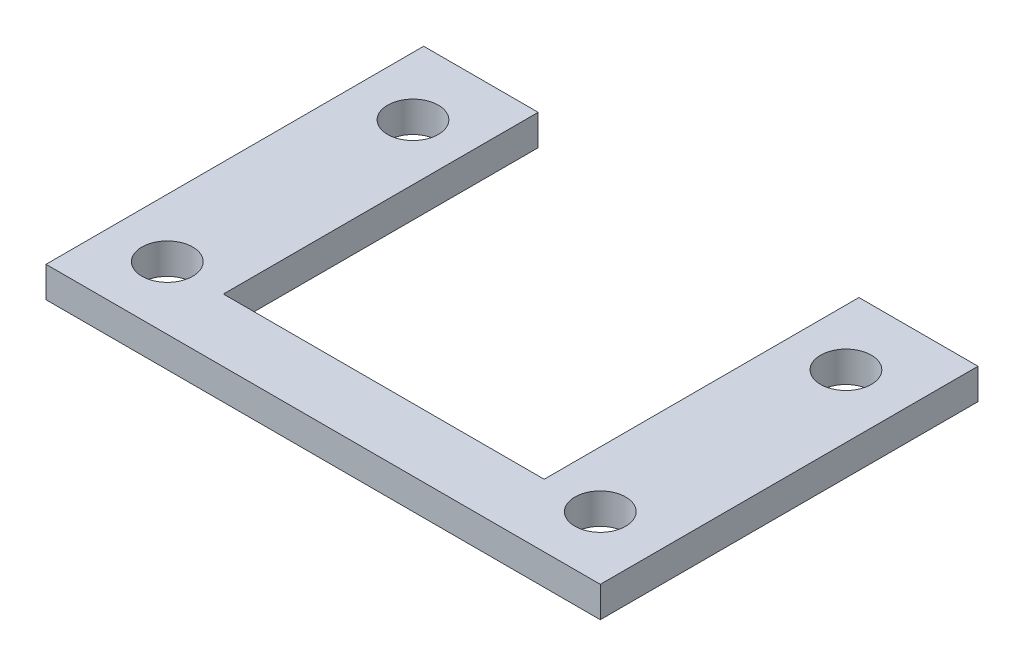
ISO-10303-21;
HEADER;
FILE_DESCRIPTION(('STEP AP214'),'2;1');
FILE_NAME('part.step','',(''),(''),'','','');
FILE_SCHEMA(('AUTOMOTIVE_DESIGN { 1 0 10303 214 1 1 1 1 }'));
ENDSEC;
DATA;
#1=APPLICATION_CONTEXT('core data for automotive mechanical design processes');
#2=APPLICATION_PROTOCOL_DEFINITION('international standard','automotive_design',2000,#1);
#3=PRODUCT_CONTEXT('',#1,'mechanical');
#4=PRODUCT('Part','Part','',(#3));
#5=PRODUCT_RELATED_PRODUCT_CATEGORY('part','',(#4));
#6=PRODUCT_DEFINITION_FORMATION('','',#4);
#7=PRODUCT_DEFINITION_CONTEXT('part definition',#1,'design');
#8=PRODUCT_DEFINITION('design','',#6,#7);
#9=PRODUCT_DEFINITION_SHAPE('','',#8);
#10=(LENGTH_UNIT() NAMED_UNIT(*) SI_UNIT(.MILLI.,.METRE.));
#11=(NAMED_UNIT(*) PLANE_ANGLE_UNIT() SI_UNIT($,.RADIAN.));
#12=(NAMED_UNIT(*) SI_UNIT($,.STERADIAN.) SOLID_ANGLE_UNIT());
#13=UNCERTAINTY_MEASURE_WITH_UNIT(LENGTH_MEASURE(1.E-05),#10,'distance_accuracy_value','');
#14=(GEOMETRIC_REPRESENTATION_CONTEXT(3) GLOBAL_UNCERTAINTY_ASSIGNED_CONTEXT((#13)) GLOBAL_UNIT_ASSIGNED_CONTEXT((#10,
#11,#12)) REPRESENTATION_CONTEXT('',''));
#15=CARTESIAN_POINT('',(0.,0.,0.));
#16=DIRECTION('',(0.,0.,1.));
#17=DIRECTION('',(1.,0.,0.));
#18=AXIS2_PLACEMENT_3D('',#15,#16,#17);
#19=CARTESIAN_POINT('',(0.,2.54,0.));
#20=DIRECTION('',(0.,1.,0.));
#21=DIRECTION('',(0.,0.,1.));
#22=AXIS2_PLACEMENT_3D('',#19,#20,#21);
#23=PLANE('',#22);
#24=CARTESIAN_POINT('',(56.209107250434,2.54,-23.3955963790764));
#25=DIRECTION('',(0.,1.,0.));
#26=DIRECTION('',(0.,0.,1.));
#27=AXIS2_PLACEMENT_3D('',#24,#25,#26);
#28=CIRCLE('',#27,2.09999999999999);
#29=CARTESIAN_POINT('',(56.209107250434,2.54,-21.2955963790764));
#30=VERTEX_POINT('',#29);
#31=EDGE_CURVE('E221',#30,#30,#28,.T.);
#32=ORIENTED_EDGE('',*,*,#31,.F.);
#33=EDGE_LOOP('',(#32));
#34=FACE_BOUND('',#33,.T.);
#35=CARTESIAN_POINT('',(20.395107250434,2.54,-23.3955963790764));
#36=DIRECTION('',(0.,1.,0.));
#37=DIRECTION('',(0.,0.,1.));
#38=AXIS2_PLACEMENT_3D('',#35,#36,#37);
#39=CIRCLE('',#38,2.1);
#40=CARTESIAN_POINT('',(20.395107250434,2.54,-21.2955963790764));
#41=VERTEX_POINT('',#40);
#42=EDGE_CURVE('E146',#41,#41,#39,.T.);
#43=ORIENTED_EDGE('',*,*,#42,.F.);
#44=EDGE_LOOP('',(#43));
#45=FACE_BOUND('',#44,.T.);
#46=DIRECTION('',(0.,0.,1.));
#47=VECTOR('',#46,1.);
#48=CARTESIAN_POINT('',(15.5691041376411,2.54,-29.1105972946034));
#49=LINE('',#48,#47);
#50=CARTESIAN_POINT('',(15.5691041376411,2.54,-29.1105972946034));
#51=VERTEX_POINT('',#50);
#52=CARTESIAN_POINT('',(15.5691041376411,2.54,2.13140328523063));
#53=VERTEX_POINT('',#52);
#54=EDGE_CURVE('E164',#51,#53,#49,.T.);
#55=ORIENTED_EDGE('',*,*,#54,.T.);
#56=DIRECTION('',(1.,0.,0.));
#57=VECTOR('',#56,1.);
#58=CARTESIAN_POINT('',(15.5691041376411,2.54,2.13140328523063));
#59=LINE('',#58,#57);
#60=CARTESIAN_POINT('',(61.4161118891041,2.54,2.13140328523063));
#61=VERTEX_POINT('',#60);
#62=EDGE_CURVE('E100',#53,#61,#59,.T.);
#63=ORIENTED_EDGE('',*,*,#62,.T.);
#64=DIRECTION('',(0.,0.,-1.));
#65=VECTOR('',#64,1.);
#66=CARTESIAN_POINT('',(61.4161118891041,2.54,-29.1105972946034));
#67=LINE('',#66,#65);
#68=CARTESIAN_POINT('',(61.4161118891041,2.54,-29.1105972946034));
#69=VERTEX_POINT('',#68);
#70=EDGE_CURVE('E185',#61,#69,#67,.T.);
#71=ORIENTED_EDGE('',*,*,#70,.T.);
#72=DIRECTION('',(-1.,0.,0.));
#73=VECTOR('',#72,1.);
#74=CARTESIAN_POINT('',(51.5691072504341,2.54,-29.1105972946034));
#75=LINE('',#74,#73);
#76=CARTESIAN_POINT('',(51.5691072504341,2.54,-29.1105972946034));
#77=VERTEX_POINT('',#76);
#78=EDGE_CURVE('E199',#69,#77,#75,.T.);
#79=ORIENTED_EDGE('',*,*,#78,.T.);
#80=DIRECTION('',(0.,0.,1.));
#81=VECTOR('',#80,1.);
#82=CARTESIAN_POINT('',(51.5691072504341,2.54,-29.1105972946034));
#83=LINE('',#82,#81);
#84=CARTESIAN_POINT('',(51.5691072504341,2.54,-3.07559637907637));
#85=VERTEX_POINT('',#84);
#86=EDGE_CURVE('E119',#77,#85,#83,.T.);
#87=ORIENTED_EDGE('',*,*,#86,.T.);
#88=DIRECTION('',(-1.,0.,0.));
#89=VECTOR('',#88,1.);
#90=CARTESIAN_POINT('',(25.035107250434,2.54,-3.07559637907637));
#91=LINE('',#90,#89);
#92=CARTESIAN_POINT('',(25.035107250434,2.54,-3.07559637907637));
#93=VERTEX_POINT('',#92);
#94=EDGE_CURVE('E113',#85,#93,#91,.T.);
#95=ORIENTED_EDGE('',*,*,#94,.T.);
#96=DIRECTION('',(0.,0.,-1.));
#97=VECTOR('',#96,1.);
#98=CARTESIAN_POINT('',(25.035107250434,2.54,-29.1105972946034));
#99=LINE('',#98,#97);
#100=CARTESIAN_POINT('',(25.035107250434,2.54,-29.1105972946034));
#101=VERTEX_POINT('',#100);
#102=EDGE_CURVE('E117',#93,#101,#99,.T.);
#103=ORIENTED_EDGE('',*,*,#102,.T.);
#104=DIRECTION('',(-1.,0.,0.));
#105=VECTOR('',#104,1.);
#106=CARTESIAN_POINT('',(15.5691041376411,2.54,-29.1105972946034));
#107=LINE('',#106,#105);
#108=EDGE_CURVE('E57',#101,#51,#107,.T.);
#109=ORIENTED_EDGE('',*,*,#108,.T.);
#110=EDGE_LOOP('',(#55,#63,#71,#79,#87,#95,#103,#109));
#111=FACE_BOUND('',#110,.T.);
#112=CARTESIAN_POINT('',(20.395107250434,2.54,-3.07559637907637));
#113=DIRECTION('',(0.,1.,0.));
#114=DIRECTION('',(0.,0.,1.));
#115=AXIS2_PLACEMENT_3D('',#112,#113,#114);
#116=CIRCLE('',#115,2.1);
#117=CARTESIAN_POINT('',(20.395107250434,2.54,-0.975596379076362));
#118=VERTEX_POINT('',#117);
#119=EDGE_CURVE('E213',#118,#118,#116,.T.);
#120=ORIENTED_EDGE('',*,*,#119,.F.);
#121=EDGE_LOOP('',(#120));
#122=FACE_BOUND('',#121,.T.);
#123=CARTESIAN_POINT('',(56.209107250434,2.54,-3.07559637907637));
#124=DIRECTION('',(0.,1.,0.));
#125=DIRECTION('',(0.,0.,1.));
#126=AXIS2_PLACEMENT_3D('',#123,#124,#125);
#127=CIRCLE('',#126,2.09999999999999);
#128=CARTESIAN_POINT('',(56.209107250434,2.54,-0.975596379076378));
#129=VERTEX_POINT('',#128);
#130=EDGE_CURVE('E229',#129,#129,#127,.T.);
#131=ORIENTED_EDGE('',*,*,#130,.F.);
#132=EDGE_LOOP('',(#131));
#133=FACE_BOUND('',#132,.T.);
#134=ADVANCED_FACE('F39',(#34,#45,#111,#122,#133),#23,.T.);
#135=CARTESIAN_POINT('',(0.,0.,0.));
#136=DIRECTION('',(0.,1.,0.));
#137=DIRECTION('',(0.,0.,1.));
#138=AXIS2_PLACEMENT_3D('',#135,#136,#137);
#139=PLANE('',#138);
#140=DIRECTION('',(0.,0.,1.));
#141=VECTOR('',#140,1.);
#142=CARTESIAN_POINT('',(15.5691041376411,0.,-29.1105972946034));
#143=LINE('',#142,#141);
#144=CARTESIAN_POINT('',(15.5691041376411,0.,-29.1105972946034));
#145=VERTEX_POINT('',#144);
#146=CARTESIAN_POINT('',(15.5691041376411,0.,2.13140328523063));
#147=VERTEX_POINT('',#146);
#148=EDGE_CURVE('E141',#145,#147,#143,.T.);
#149=ORIENTED_EDGE('',*,*,#148,.F.);
#150=DIRECTION('',(-1.,0.,0.));
#151=VECTOR('',#150,1.);
#152=CARTESIAN_POINT('',(15.5691041376411,0.,-29.1105972946034));
#153=LINE('',#152,#151);
#154=CARTESIAN_POINT('',(25.035107250434,0.,-29.1105972946034));
#155=VERTEX_POINT('',#154);
#156=EDGE_CURVE('E92',#155,#145,#153,.T.);
#157=ORIENTED_EDGE('',*,*,#156,.F.);
#158=DIRECTION('',(0.,0.,-1.));
#159=VECTOR('',#158,1.);
#160=CARTESIAN_POINT('',(25.035107250434,0.,-29.1105972946034));
#161=LINE('',#160,#159);
#162=CARTESIAN_POINT('',(25.035107250434,0.,-3.07559637907637));
#163=VERTEX_POINT('',#162);
#164=EDGE_CURVE('E86',#163,#155,#161,.T.);
#165=ORIENTED_EDGE('',*,*,#164,.F.);
#166=DIRECTION('',(-1.,0.,0.));
#167=VECTOR('',#166,1.);
#168=CARTESIAN_POINT('',(25.035107250434,0.,-3.07559637907637));
#169=LINE('',#168,#167);
#170=CARTESIAN_POINT('',(51.5691072504341,0.,-3.07559637907637));
#171=VERTEX_POINT('',#170);
#172=EDGE_CURVE('E128',#171,#163,#169,.T.);
#173=ORIENTED_EDGE('',*,*,#172,.F.);
#174=DIRECTION('',(0.,0.,1.));
#175=VECTOR('',#174,1.);
#176=CARTESIAN_POINT('',(51.5691072504341,0.,-29.1105972946034));
#177=LINE('',#176,#175);
#178=CARTESIAN_POINT('',(51.5691072504341,0.,-29.1105972946034));
#179=VERTEX_POINT('',#178);
#180=EDGE_CURVE('E155',#179,#171,#177,.T.);
#181=ORIENTED_EDGE('',*,*,#180,.F.);
#182=DIRECTION('',(-1.,0.,0.));
#183=VECTOR('',#182,1.);
#184=CARTESIAN_POINT('',(51.5691072504341,0.,-29.1105972946034));
#185=LINE('',#184,#183);
#186=CARTESIAN_POINT('',(61.4161118891041,0.,-29.1105972946034));
#187=VERTEX_POINT('',#186);
#188=EDGE_CURVE('E152',#187,#179,#185,.T.);
#189=ORIENTED_EDGE('',*,*,#188,.F.);
#190=DIRECTION('',(0.,0.,-1.));
#191=VECTOR('',#190,1.);
#192=CARTESIAN_POINT('',(61.4161118891041,0.,-29.1105972946034));
#193=LINE('',#192,#191);
#194=CARTESIAN_POINT('',(61.4161118891041,0.,2.13140328523063));
#195=VERTEX_POINT('',#194);
#196=EDGE_CURVE('E149',#195,#187,#193,.T.);
#197=ORIENTED_EDGE('',*,*,#196,.F.);
#198=DIRECTION('',(1.,0.,0.));
#199=VECTOR('',#198,1.);
#200=CARTESIAN_POINT('',(15.5691041376411,0.,2.13140328523063));
#201=LINE('',#200,#199);
#202=EDGE_CURVE('E145',#147,#195,#201,.T.);
#203=ORIENTED_EDGE('',*,*,#202,.F.);
#204=EDGE_LOOP('',(#149,#157,#165,#173,#181,#189,#197,#203));
#205=FACE_BOUND('',#204,.T.);
#206=CARTESIAN_POINT('',(20.395107250434,0.,-23.3955963790764));
#207=DIRECTION('',(0.,1.,0.));
#208=DIRECTION('',(0.,0.,1.));
#209=AXIS2_PLACEMENT_3D('',#206,#207,#208);
#210=CIRCLE('',#209,2.1);
#211=CARTESIAN_POINT('',(20.395107250434,0.,-21.2955963790764));
#212=VERTEX_POINT('',#211);
#213=EDGE_CURVE('E209',#212,#212,#210,.T.);
#214=ORIENTED_EDGE('',*,*,#213,.T.);
#215=EDGE_LOOP('',(#214));
#216=FACE_BOUND('',#215,.T.);
#217=CARTESIAN_POINT('',(20.395107250434,0.,-3.07559637907637));
#218=DIRECTION('',(0.,1.,0.));
#219=DIRECTION('',(0.,0.,1.));
#220=AXIS2_PLACEMENT_3D('',#217,#218,#219);
#221=CIRCLE('',#220,2.1);
#222=CARTESIAN_POINT('',(20.395107250434,0.,-0.975596379076362));
#223=VERTEX_POINT('',#222);
#224=EDGE_CURVE('E217',#223,#223,#221,.T.);
#225=ORIENTED_EDGE('',*,*,#224,.T.);
#226=EDGE_LOOP('',(#225));
#227=FACE_BOUND('',#226,.T.);
#228=CARTESIAN_POINT('',(56.209107250434,0.,-23.3955963790764));
#229=DIRECTION('',(0.,1.,0.));
#230=DIRECTION('',(0.,0.,1.));
#231=AXIS2_PLACEMENT_3D('',#228,#229,#230);
#232=CIRCLE('',#231,2.09999999999999);
#233=CARTESIAN_POINT('',(56.209107250434,0.,-21.2955963790764));
#234=VERTEX_POINT('',#233);
#235=EDGE_CURVE('E225',#234,#234,#232,.T.);
#236=ORIENTED_EDGE('',*,*,#235,.T.);
#237=EDGE_LOOP('',(#236));
#238=FACE_BOUND('',#237,.T.);
#239=CARTESIAN_POINT('',(56.209107250434,0.,-3.07559637907637));
#240=DIRECTION('',(0.,1.,0.));
#241=DIRECTION('',(0.,0.,1.));
#242=AXIS2_PLACEMENT_3D('',#239,#240,#241);
#243=CIRCLE('',#242,2.09999999999999);
#244=CARTESIAN_POINT('',(56.209107250434,0.,-0.975596379076378));
#245=VERTEX_POINT('',#244);
#246=EDGE_CURVE('E233',#245,#245,#243,.T.);
#247=ORIENTED_EDGE('',*,*,#246,.T.);
#248=EDGE_LOOP('',(#247));
#249=FACE_BOUND('',#248,.T.);
#250=ADVANCED_FACE('F189',(#205,#216,#227,#238,#249),#139,.F.);
#251=CARTESIAN_POINT('',(15.5691041376411,2.54,-29.1105972946034));
#252=DIRECTION('',(1.,0.,0.));
#253=DIRECTION('',(0.,0.,-1.));
#254=AXIS2_PLACEMENT_3D('',#251,#252,#253);
#255=PLANE('',#254);
#256=ORIENTED_EDGE('',*,*,#148,.T.);
#257=DIRECTION('',(0.,-1.,0.));
#258=VECTOR('',#257,1.);
#259=CARTESIAN_POINT('',(15.5691041376411,2.54,2.13140328523063));
#260=LINE('',#259,#258);
#261=EDGE_CURVE('E11',#53,#147,#260,.T.);
#262=ORIENTED_EDGE('',*,*,#261,.F.);
#263=ORIENTED_EDGE('',*,*,#54,.F.);
#264=DIRECTION('',(0.,-1.,0.));
#265=VECTOR('',#264,1.);
#266=CARTESIAN_POINT('',(15.5691041376411,2.54,-29.1105972946034));
#267=LINE('',#266,#265);
#268=EDGE_CURVE('E137',#51,#145,#267,.T.);
#269=ORIENTED_EDGE('',*,*,#268,.T.);
#270=EDGE_LOOP('',(#256,#262,#263,#269));
#271=FACE_BOUND('',#270,.T.);
#272=ADVANCED_FACE('F41',(#271),#255,.F.);
#273=CARTESIAN_POINT('',(15.5691041376411,2.54,2.13140328523063));
#274=DIRECTION('',(0.,0.,-1.));
#275=DIRECTION('',(-1.,0.,0.));
#276=AXIS2_PLACEMENT_3D('',#273,#274,#275);
#277=PLANE('',#276);
#278=ORIENTED_EDGE('',*,*,#202,.T.);
#279=DIRECTION('',(0.,-1.,0.));
#280=VECTOR('',#279,1.);
#281=CARTESIAN_POINT('',(61.4161118891041,2.54,2.13140328523063));
#282=LINE('',#281,#280);
#283=EDGE_CURVE('E49',#61,#195,#282,.T.);
#284=ORIENTED_EDGE('',*,*,#283,.F.);
#285=ORIENTED_EDGE('',*,*,#62,.F.);
#286=ORIENTED_EDGE('',*,*,#261,.T.);
#287=EDGE_LOOP('',(#278,#284,#285,#286));
#288=FACE_BOUND('',#287,.T.);
#289=ADVANCED_FACE('F269',(#288),#277,.F.);
#290=CARTESIAN_POINT('',(61.4161118891041,2.54,-29.1105972946034));
#291=DIRECTION('',(-1.,0.,0.));
#292=DIRECTION('',(0.,0.,1.));
#293=AXIS2_PLACEMENT_3D('',#290,#291,#292);
#294=PLANE('',#293);
#295=ORIENTED_EDGE('',*,*,#196,.T.);
#296=DIRECTION('',(0.,-1.,0.));
#297=VECTOR('',#296,1.);
#298=CARTESIAN_POINT('',(61.4161118891041,2.54,-29.1105972946034));
#299=LINE('',#298,#297);
#300=EDGE_CURVE('E175',#69,#187,#299,.T.);
#301=ORIENTED_EDGE('',*,*,#300,.F.);
#302=ORIENTED_EDGE('',*,*,#70,.F.);
#303=ORIENTED_EDGE('',*,*,#283,.T.);
#304=EDGE_LOOP('',(#295,#301,#302,#303));
#305=FACE_BOUND('',#304,.T.);
#306=ADVANCED_FACE('F183',(#305),#294,.F.);
#307=CARTESIAN_POINT('',(51.5691072504341,2.54,-29.1105972946034));
#308=DIRECTION('',(0.,0.,1.));
#309=DIRECTION('',(1.,0.,0.));
#310=AXIS2_PLACEMENT_3D('',#307,#308,#309);
#311=PLANE('',#310);
#312=ORIENTED_EDGE('',*,*,#188,.T.);
#313=DIRECTION('',(0.,-1.,0.));
#314=VECTOR('',#313,1.);
#315=CARTESIAN_POINT('',(51.5691072504341,2.54,-29.1105972946034));
#316=LINE('',#315,#314);
#317=EDGE_CURVE('E171',#77,#179,#316,.T.);
#318=ORIENTED_EDGE('',*,*,#317,.F.);
#319=ORIENTED_EDGE('',*,*,#78,.F.);
#320=ORIENTED_EDGE('',*,*,#300,.T.);
#321=EDGE_LOOP('',(#312,#318,#319,#320));
#322=FACE_BOUND('',#321,.T.);
#323=ADVANCED_FACE('F194',(#322),#311,.F.);
#324=CARTESIAN_POINT('',(51.5691072504341,2.54,-29.1105972946034));
#325=DIRECTION('',(1.,0.,0.));
#326=DIRECTION('',(0.,0.,-1.));
#327=AXIS2_PLACEMENT_3D('',#324,#325,#326);
#328=PLANE('',#327);
#329=ORIENTED_EDGE('',*,*,#180,.T.);
#330=DIRECTION('',(0.,-1.,0.));
#331=VECTOR('',#330,1.);
#332=CARTESIAN_POINT('',(51.5691072504341,2.54,-3.07559637907637));
#333=LINE('',#332,#331);
#334=EDGE_CURVE('E130',#85,#171,#333,.T.);
#335=ORIENTED_EDGE('',*,*,#334,.F.);
#336=ORIENTED_EDGE('',*,*,#86,.F.);
#337=ORIENTED_EDGE('',*,*,#317,.T.);
#338=EDGE_LOOP('',(#329,#335,#336,#337));
#339=FACE_BOUND('',#338,.T.);
#340=ADVANCED_FACE('F197',(#339),#328,.F.);
#341=CARTESIAN_POINT('',(25.035107250434,2.54,-3.07559637907637));
#342=DIRECTION('',(0.,0.,1.));
#343=DIRECTION('',(1.,0.,0.));
#344=AXIS2_PLACEMENT_3D('',#341,#342,#343);
#345=PLANE('',#344);
#346=ORIENTED_EDGE('',*,*,#172,.T.);
#347=DIRECTION('',(0.,-1.,0.));
#348=VECTOR('',#347,1.);
#349=CARTESIAN_POINT('',(25.035107250434,2.54,-3.07559637907637));
#350=LINE('',#349,#348);
#351=EDGE_CURVE('E125',#93,#163,#350,.T.);
#352=ORIENTED_EDGE('',*,*,#351,.F.);
#353=ORIENTED_EDGE('',*,*,#94,.F.);
#354=ORIENTED_EDGE('',*,*,#334,.T.);
#355=EDGE_LOOP('',(#346,#352,#353,#354));
#356=FACE_BOUND('',#355,.T.);
#357=ADVANCED_FACE('F126',(#356),#345,.F.);
#358=CARTESIAN_POINT('',(25.035107250434,2.54,-29.1105972946034));
#359=DIRECTION('',(-1.,0.,0.));
#360=DIRECTION('',(0.,0.,1.));
#361=AXIS2_PLACEMENT_3D('',#358,#359,#360);
#362=PLANE('',#361);
#363=ORIENTED_EDGE('',*,*,#164,.T.);
#364=DIRECTION('',(0.,-1.,0.));
#365=VECTOR('',#364,1.);
#366=CARTESIAN_POINT('',(25.035107250434,2.54,-29.1105972946034));
#367=LINE('',#366,#365);
#368=EDGE_CURVE('E131',#101,#155,#367,.T.);
#369=ORIENTED_EDGE('',*,*,#368,.F.);
#370=ORIENTED_EDGE('',*,*,#102,.F.);
#371=ORIENTED_EDGE('',*,*,#351,.T.);
#372=EDGE_LOOP('',(#363,#369,#370,#371));
#373=FACE_BOUND('',#372,.T.);
#374=ADVANCED_FACE('F133',(#373),#362,.F.);
#375=CARTESIAN_POINT('',(15.5691041376411,2.54,-29.1105972946034));
#376=DIRECTION('',(0.,0.,1.));
#377=DIRECTION('',(1.,0.,0.));
#378=AXIS2_PLACEMENT_3D('',#375,#376,#377);
#379=PLANE('',#378);
#380=ORIENTED_EDGE('',*,*,#156,.T.);
#381=ORIENTED_EDGE('',*,*,#268,.F.);
#382=ORIENTED_EDGE('',*,*,#108,.F.);
#383=ORIENTED_EDGE('',*,*,#368,.T.);
#384=EDGE_LOOP('',(#380,#381,#382,#383));
#385=FACE_BOUND('',#384,.T.);
#386=ADVANCED_FACE('F257',(#385),#379,.F.);
#387=CARTESIAN_POINT('',(20.395107250434,2.54,-23.3955963790764));
#388=DIRECTION('',(0.,-1.,0.));
#389=DIRECTION('',(0.,0.,-1.));
#390=AXIS2_PLACEMENT_3D('',#387,#388,#389);
#391=CYLINDRICAL_SURFACE('',#390,2.1);
#392=ORIENTED_EDGE('',*,*,#42,.T.);
#393=EDGE_LOOP('',(#392));
#394=FACE_BOUND('',#393,.T.);
#395=ORIENTED_EDGE('',*,*,#213,.F.);
#396=EDGE_LOOP('',(#395));
#397=FACE_BOUND('',#396,.T.);
#398=ADVANCED_FACE('F254',(#394,#397),#391,.F.);
#399=CARTESIAN_POINT('',(20.395107250434,2.54,-3.07559637907637));
#400=DIRECTION('',(0.,-1.,0.));
#401=DIRECTION('',(0.,0.,-1.));
#402=AXIS2_PLACEMENT_3D('',#399,#400,#401);
#403=CYLINDRICAL_SURFACE('',#402,2.1);
#404=ORIENTED_EDGE('',*,*,#119,.T.);
#405=EDGE_LOOP('',(#404));
#406=FACE_BOUND('',#405,.T.);
#407=ORIENTED_EDGE('',*,*,#224,.F.);
#408=EDGE_LOOP('',(#407));
#409=FACE_BOUND('',#408,.T.);
#410=ADVANCED_FACE('F333',(#406,#409),#403,.F.);
#411=CARTESIAN_POINT('',(56.209107250434,2.54,-23.3955963790764));
#412=DIRECTION('',(0.,-1.,0.));
#413=DIRECTION('',(0.,0.,-1.));
#414=AXIS2_PLACEMENT_3D('',#411,#412,#413);
#415=CYLINDRICAL_SURFACE('',#414,2.09999999999999);
#416=ORIENTED_EDGE('',*,*,#31,.T.);
#417=EDGE_LOOP('',(#416));
#418=FACE_BOUND('',#417,.T.);
#419=ORIENTED_EDGE('',*,*,#235,.F.);
#420=EDGE_LOOP('',(#419));
#421=FACE_BOUND('',#420,.T.);
#422=ADVANCED_FACE('F341',(#418,#421),#415,.F.);
#423=CARTESIAN_POINT('',(56.209107250434,2.54,-3.07559637907637));
#424=DIRECTION('',(0.,-1.,0.));
#425=DIRECTION('',(0.,0.,-1.));
#426=AXIS2_PLACEMENT_3D('',#423,#424,#425);
#427=CYLINDRICAL_SURFACE('',#426,2.09999999999999);
#428=ORIENTED_EDGE('',*,*,#130,.T.);
#429=EDGE_LOOP('',(#428));
#430=FACE_BOUND('',#429,.T.);
#431=ORIENTED_EDGE('',*,*,#246,.F.);
#432=EDGE_LOOP('',(#431));
#433=FACE_BOUND('',#432,.T.);
#434=ADVANCED_FACE('F241',(#430,#433),#427,.F.);
#435=CLOSED_SHELL('',(#134,#250,#272,#289,#306,#323,#340,#357,#374,#386,#398,#410,#422,#434));
#436=MANIFOLD_SOLID_BREP('B2',#435);
#437=ADVANCED_BREP_SHAPE_REPRESENTATION('',(#18,#436),#14);
#438=SHAPE_DEFINITION_REPRESENTATION(#9,#437);
ENDSEC;
END-ISO-10303-21;
